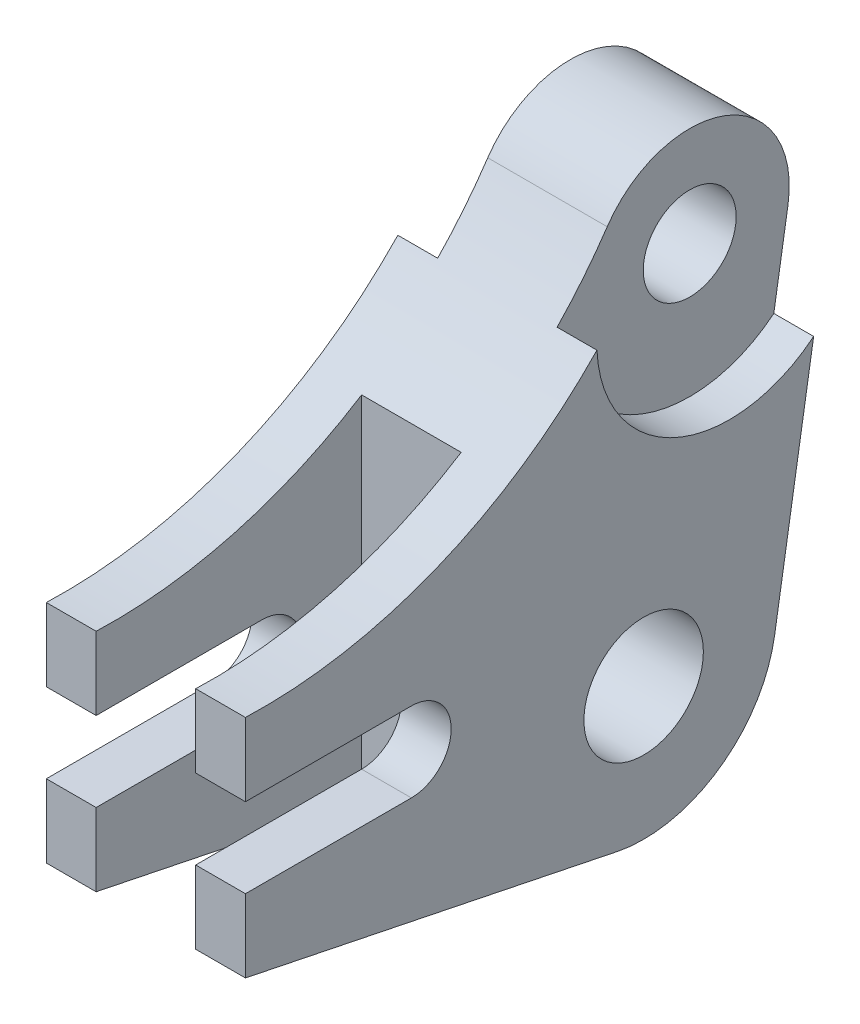
ISO-10303-21;
HEADER;
FILE_DESCRIPTION(('STEP AP214'),'2;1');
FILE_NAME('part.step','',(''),(''),'','','');
FILE_SCHEMA(('AUTOMOTIVE_DESIGN { 1 0 10303 214 1 1 1 1 }'));
ENDSEC;
DATA;
#1=APPLICATION_CONTEXT('core data for automotive mechanical design processes');
#2=APPLICATION_PROTOCOL_DEFINITION('international standard','automotive_design',2000,#1);
#3=PRODUCT_CONTEXT('',#1,'mechanical');
#4=PRODUCT('Part','Part','',(#3));
#5=PRODUCT_RELATED_PRODUCT_CATEGORY('part','',(#4));
#6=PRODUCT_DEFINITION_FORMATION('','',#4);
#7=PRODUCT_DEFINITION_CONTEXT('part definition',#1,'design');
#8=PRODUCT_DEFINITION('design','',#6,#7);
#9=PRODUCT_DEFINITION_SHAPE('','',#8);
#10=(LENGTH_UNIT() NAMED_UNIT(*) SI_UNIT(.MILLI.,.METRE.));
#11=(NAMED_UNIT(*) PLANE_ANGLE_UNIT() SI_UNIT($,.RADIAN.));
#12=(NAMED_UNIT(*) SI_UNIT($,.STERADIAN.) SOLID_ANGLE_UNIT());
#13=UNCERTAINTY_MEASURE_WITH_UNIT(LENGTH_MEASURE(1.E-05),#10,'distance_accuracy_value','');
#14=(GEOMETRIC_REPRESENTATION_CONTEXT(3) GLOBAL_UNCERTAINTY_ASSIGNED_CONTEXT((#13)) GLOBAL_UNIT_ASSIGNED_CONTEXT((#10,
#11,#12)) REPRESENTATION_CONTEXT('',''));
#15=CARTESIAN_POINT('',(0.,0.,0.));
#16=DIRECTION('',(0.,0.,1.));
#17=DIRECTION('',(1.,0.,0.));
#18=AXIS2_PLACEMENT_3D('',#15,#16,#17);
#19=CARTESIAN_POINT('',(15.,95.8680502202487,57.5));
#20=DIRECTION('',(-1.,0.,0.));
#21=DIRECTION('',(0.,0.,1.));
#22=AXIS2_PLACEMENT_3D('',#19,#20,#21);
#23=CYLINDRICAL_SURFACE('',#22,70.);
#24=CARTESIAN_POINT('',(7.50364351418238,95.8680502202487,57.5));
#25=DIRECTION('',(-1.,0.,0.));
#26=DIRECTION('',(0.,0.,1.));
#27=AXIS2_PLACEMENT_3D('',#24,#25,#26);
#28=CIRCLE('',#27,70.);
#29=CARTESIAN_POINT('',(7.50364351418238,25.9127073220826,60.));
#30=VERTEX_POINT('',#29);
#31=CARTESIAN_POINT('',(7.50364351418238,36.7600981325642,20.));
#32=VERTEX_POINT('',#31);
#33=EDGE_CURVE('E274',#30,#32,#28,.F.);
#34=ORIENTED_EDGE('',*,*,#33,.F.);
#35=DIRECTION('',(-1.,0.,0.));
#36=VECTOR('',#35,1.);
#37=CARTESIAN_POINT('',(15.,25.9127073220826,60.));
#38=LINE('',#37,#36);
#39=CARTESIAN_POINT('',(15.,25.9127073220826,60.));
#40=VERTEX_POINT('',#39);
#41=EDGE_CURVE('E222',#40,#30,#38,.T.);
#42=ORIENTED_EDGE('',*,*,#41,.F.);
#43=CARTESIAN_POINT('',(15.,95.8680502202487,57.5));
#44=DIRECTION('',(-1.,0.,0.));
#45=DIRECTION('',(0.,0.,-1.));
#46=AXIS2_PLACEMENT_3D('',#43,#44,#45);
#47=CIRCLE('',#46,70.);
#48=CARTESIAN_POINT('',(15.,47.3554130899807,7.03690419061722));
#49=VERTEX_POINT('',#48);
#50=EDGE_CURVE('E363',#49,#40,#47,.T.);
#51=ORIENTED_EDGE('',*,*,#50,.F.);
#52=DIRECTION('',(1.,0.,0.));
#53=VECTOR('',#52,1.);
#54=CARTESIAN_POINT('',(12.,47.3554130899807,7.03690419061722));
#55=LINE('',#54,#53);
#56=CARTESIAN_POINT('',(9.,47.3554130899807,7.03690419061722));
#57=VERTEX_POINT('',#56);
#58=EDGE_CURVE('E244',#49,#57,#55,.F.);
#59=ORIENTED_EDGE('',*,*,#58,.T.);
#60=CARTESIAN_POINT('',(9.,95.8680502202487,57.5));
#61=DIRECTION('',(1.,0.,0.));
#62=DIRECTION('',(0.,0.,-1.));
#63=AXIS2_PLACEMENT_3D('',#60,#61,#62);
#64=CIRCLE('',#63,70.);
#65=CARTESIAN_POINT('',(9.,56.6913075919468,-0.51019597480941));
#66=VERTEX_POINT('',#65);
#67=EDGE_CURVE('E249',#66,#57,#64,.F.);
#68=ORIENTED_EDGE('',*,*,#67,.F.);
#69=DIRECTION('',(-1.,0.,0.));
#70=VECTOR('',#69,1.);
#71=CARTESIAN_POINT('',(15.,56.6913075919468,-0.51019597480941));
#72=LINE('',#71,#70);
#73=CARTESIAN_POINT('',(-9.,56.6913075919468,-0.510195974809398));
#74=VERTEX_POINT('',#73);
#75=EDGE_CURVE('E228',#66,#74,#72,.T.);
#76=ORIENTED_EDGE('',*,*,#75,.T.);
#77=CARTESIAN_POINT('',(-9.,95.8680502202487,57.5));
#78=DIRECTION('',(-1.,0.,0.));
#79=DIRECTION('',(0.,0.,1.));
#80=AXIS2_PLACEMENT_3D('',#77,#78,#79);
#81=CIRCLE('',#80,70.);
#82=CARTESIAN_POINT('',(-9.,47.3554130899807,7.03690419061722));
#83=VERTEX_POINT('',#82);
#84=EDGE_CURVE('E254',#83,#74,#81,.F.);
#85=ORIENTED_EDGE('',*,*,#84,.F.);
#86=DIRECTION('',(-1.,0.,0.));
#87=VECTOR('',#86,1.);
#88=CARTESIAN_POINT('',(-12.,47.3554130899807,7.03690419061722));
#89=LINE('',#88,#87);
#90=CARTESIAN_POINT('',(-15.,47.3554130899807,7.03690419061722));
#91=VERTEX_POINT('',#90);
#92=EDGE_CURVE('E257',#91,#83,#89,.F.);
#93=ORIENTED_EDGE('',*,*,#92,.F.);
#94=CARTESIAN_POINT('',(-15.,95.8680502202487,57.5));
#95=DIRECTION('',(-1.,0.,0.));
#96=DIRECTION('',(0.,0.,-1.));
#97=AXIS2_PLACEMENT_3D('',#94,#95,#96);
#98=CIRCLE('',#97,70.);
#99=CARTESIAN_POINT('',(-15.,25.9127073220826,60.));
#100=VERTEX_POINT('',#99);
#101=EDGE_CURVE('E219',#91,#100,#98,.T.);
#102=ORIENTED_EDGE('',*,*,#101,.T.);
#103=CARTESIAN_POINT('',(-7.49635648581762,25.9127073220826,60.));
#104=VERTEX_POINT('',#103);
#105=EDGE_CURVE('E211',#104,#100,#38,.T.);
#106=ORIENTED_EDGE('',*,*,#105,.F.);
#107=CARTESIAN_POINT('',(-7.49635648581762,95.8680502202487,57.5));
#108=DIRECTION('',(1.,0.,0.));
#109=DIRECTION('',(0.,0.,-1.));
#110=AXIS2_PLACEMENT_3D('',#107,#108,#109);
#111=CIRCLE('',#110,70.);
#112=CARTESIAN_POINT('',(-7.49635648581762,36.7600981325642,20.));
#113=VERTEX_POINT('',#112);
#114=EDGE_CURVE('E193',#113,#104,#111,.F.);
#115=ORIENTED_EDGE('',*,*,#114,.F.);
#116=DIRECTION('',(-1.,0.,0.));
#117=VECTOR('',#116,1.);
#118=CARTESIAN_POINT('',(15.,36.7600981325642,20.));
#119=LINE('',#118,#117);
#120=EDGE_CURVE('E204',#32,#113,#119,.T.);
#121=ORIENTED_EDGE('',*,*,#120,.F.);
#122=EDGE_LOOP('',(#34,#42,#51,#59,#68,#76,#85,#93,#102,#106,#115,#121));
#123=FACE_BOUND('',#122,.T.);
#124=ADVANCED_FACE('F45',(#123),#23,.F.);
#125=CARTESIAN_POINT('',(15.,25.9127073220826,60.));
#126=DIRECTION('',(0.,0.,-1.));
#127=DIRECTION('',(0.,1.,0.));
#128=AXIS2_PLACEMENT_3D('',#125,#126,#127);
#129=PLANE('',#128);
#130=DIRECTION('',(0.,-1.,0.));
#131=VECTOR('',#130,1.);
#132=CARTESIAN_POINT('',(7.50364351418238,43.8680502202487,60.));
#133=LINE('',#132,#131);
#134=CARTESIAN_POINT('',(7.50364351418238,14.9127073220824,60.));
#135=VERTEX_POINT('',#134);
#136=EDGE_CURVE('E541',#30,#135,#133,.T.);
#137=ORIENTED_EDGE('',*,*,#136,.T.);
#138=DIRECTION('',(-1.,0.,0.));
#139=VECTOR('',#138,1.);
#140=CARTESIAN_POINT('',(15.,14.9127073220825,60.));
#141=LINE('',#140,#139);
#142=CARTESIAN_POINT('',(15.,14.9127073220825,60.));
#143=VERTEX_POINT('',#142);
#144=EDGE_CURVE('E223',#143,#135,#141,.T.);
#145=ORIENTED_EDGE('',*,*,#144,.F.);
#146=DIRECTION('',(0.,-1.,0.));
#147=VECTOR('',#146,1.);
#148=CARTESIAN_POINT('',(15.,25.9127073220826,60.));
#149=LINE('',#148,#147);
#150=EDGE_CURVE('E371',#40,#143,#149,.T.);
#151=ORIENTED_EDGE('',*,*,#150,.F.);
#152=ORIENTED_EDGE('',*,*,#41,.T.);
#153=EDGE_LOOP('',(#137,#145,#151,#152));
#154=FACE_BOUND('',#153,.T.);
#155=ADVANCED_FACE('F492',(#154),#129,.F.);
#156=DIRECTION('',(0.,-1.,0.));
#157=VECTOR('',#156,1.);
#158=CARTESIAN_POINT('',(-7.49635648581762,43.8680502202487,60.));
#159=LINE('',#158,#157);
#160=CARTESIAN_POINT('',(-7.49635648581762,14.9127073220824,60.));
#161=VERTEX_POINT('',#160);
#162=EDGE_CURVE('E196',#104,#161,#159,.T.);
#163=ORIENTED_EDGE('',*,*,#162,.F.);
#164=ORIENTED_EDGE('',*,*,#105,.T.);
#165=DIRECTION('',(0.,-1.,0.));
#166=VECTOR('',#165,1.);
#167=CARTESIAN_POINT('',(-15.,25.9127073220826,60.));
#168=LINE('',#167,#166);
#169=CARTESIAN_POINT('',(-15.,14.9127073220825,60.));
#170=VERTEX_POINT('',#169);
#171=EDGE_CURVE('E332',#100,#170,#168,.T.);
#172=ORIENTED_EDGE('',*,*,#171,.T.);
#173=EDGE_CURVE('E213',#161,#170,#141,.T.);
#174=ORIENTED_EDGE('',*,*,#173,.F.);
#175=EDGE_LOOP('',(#163,#164,#172,#174));
#176=FACE_BOUND('',#175,.T.);
#177=ADVANCED_FACE('F209',(#176),#129,.F.);
#178=CARTESIAN_POINT('',(15.,14.9127073220825,35.));
#179=DIRECTION('',(0.,1.,0.));
#180=DIRECTION('',(0.,0.,1.));
#181=AXIS2_PLACEMENT_3D('',#178,#179,#180);
#182=PLANE('',#181);
#183=DIRECTION('',(0.,0.,1.));
#184=VECTOR('',#183,1.);
#185=CARTESIAN_POINT('',(7.50364351418238,14.9127073220825,35.));
#186=LINE('',#185,#184);
#187=CARTESIAN_POINT('',(7.50364351418238,14.9127073220825,35.));
#188=VERTEX_POINT('',#187);
#189=EDGE_CURVE('E435',#188,#135,#186,.T.);
#190=ORIENTED_EDGE('',*,*,#189,.F.);
#191=DIRECTION('',(-1.,0.,0.));
#192=VECTOR('',#191,1.);
#193=CARTESIAN_POINT('',(15.,14.9127073220825,35.));
#194=LINE('',#193,#192);
#195=CARTESIAN_POINT('',(15.,14.9127073220825,35.));
#196=VERTEX_POINT('',#195);
#197=EDGE_CURVE('E306',#196,#188,#194,.T.);
#198=ORIENTED_EDGE('',*,*,#197,.F.);
#199=DIRECTION('',(0.,0.,-1.));
#200=VECTOR('',#199,1.);
#201=CARTESIAN_POINT('',(15.,14.9127073220825,35.));
#202=LINE('',#201,#200);
#203=EDGE_CURVE('E374',#143,#196,#202,.T.);
#204=ORIENTED_EDGE('',*,*,#203,.F.);
#205=ORIENTED_EDGE('',*,*,#144,.T.);
#206=EDGE_LOOP('',(#190,#198,#204,#205));
#207=FACE_BOUND('',#206,.T.);
#208=ADVANCED_FACE('F530',(#207),#182,.F.);
#209=DIRECTION('',(0.,0.,-1.));
#210=VECTOR('',#209,1.);
#211=CARTESIAN_POINT('',(-7.49635648581762,14.9127073220825,35.));
#212=LINE('',#211,#210);
#213=CARTESIAN_POINT('',(-7.49635648581762,14.9127073220825,35.));
#214=VERTEX_POINT('',#213);
#215=EDGE_CURVE('E205',#161,#214,#212,.T.);
#216=ORIENTED_EDGE('',*,*,#215,.F.);
#217=ORIENTED_EDGE('',*,*,#173,.T.);
#218=DIRECTION('',(0.,0.,-1.));
#219=VECTOR('',#218,1.);
#220=CARTESIAN_POINT('',(-15.,14.9127073220825,35.));
#221=LINE('',#220,#219);
#222=CARTESIAN_POINT('',(-15.,14.9127073220825,35.));
#223=VERTEX_POINT('',#222);
#224=EDGE_CURVE('E328',#170,#223,#221,.T.);
#225=ORIENTED_EDGE('',*,*,#224,.T.);
#226=EDGE_CURVE('E305',#214,#223,#194,.T.);
#227=ORIENTED_EDGE('',*,*,#226,.F.);
#228=EDGE_LOOP('',(#216,#217,#225,#227));
#229=FACE_BOUND('',#228,.T.);
#230=ADVANCED_FACE('F329',(#229),#182,.F.);
#231=CARTESIAN_POINT('',(15.,8.91270732208245,35.));
#232=DIRECTION('',(-1.,0.,0.));
#233=DIRECTION('',(0.,0.,1.));
#234=AXIS2_PLACEMENT_3D('',#231,#232,#233);
#235=CYLINDRICAL_SURFACE('',#234,6.);
#236=CARTESIAN_POINT('',(7.50364351418238,8.91270732208245,35.));
#237=DIRECTION('',(-1.,0.,0.));
#238=DIRECTION('',(0.,0.,1.));
#239=AXIS2_PLACEMENT_3D('',#236,#237,#238);
#240=CIRCLE('',#239,6.);
#241=CARTESIAN_POINT('',(7.50364351418238,2.91270732208245,35.));
#242=VERTEX_POINT('',#241);
#243=EDGE_CURVE('E432',#242,#188,#240,.F.);
#244=ORIENTED_EDGE('',*,*,#243,.F.);
#245=DIRECTION('',(-1.,0.,0.));
#246=VECTOR('',#245,1.);
#247=CARTESIAN_POINT('',(15.,2.91270732208245,35.));
#248=LINE('',#247,#246);
#249=CARTESIAN_POINT('',(15.,2.91270732208245,35.));
#250=VERTEX_POINT('',#249);
#251=EDGE_CURVE('E302',#250,#242,#248,.T.);
#252=ORIENTED_EDGE('',*,*,#251,.F.);
#253=CARTESIAN_POINT('',(15.,8.91270732208245,35.));
#254=DIRECTION('',(-1.,0.,0.));
#255=DIRECTION('',(0.,0.,-1.));
#256=AXIS2_PLACEMENT_3D('',#253,#254,#255);
#257=CIRCLE('',#256,6.);
#258=EDGE_CURVE('E377',#196,#250,#257,.T.);
#259=ORIENTED_EDGE('',*,*,#258,.F.);
#260=ORIENTED_EDGE('',*,*,#197,.T.);
#261=EDGE_LOOP('',(#244,#252,#259,#260));
#262=FACE_BOUND('',#261,.T.);
#263=ADVANCED_FACE('F528',(#262),#235,.F.);
#264=CARTESIAN_POINT('',(-7.49635648581762,8.91270732208245,35.));
#265=DIRECTION('',(1.,0.,0.));
#266=DIRECTION('',(0.,0.,-1.));
#267=AXIS2_PLACEMENT_3D('',#264,#265,#266);
#268=CIRCLE('',#267,6.);
#269=CARTESIAN_POINT('',(-7.49635648581762,2.91270732208245,35.));
#270=VERTEX_POINT('',#269);
#271=EDGE_CURVE('E325',#214,#270,#268,.F.);
#272=ORIENTED_EDGE('',*,*,#271,.F.);
#273=ORIENTED_EDGE('',*,*,#226,.T.);
#274=CARTESIAN_POINT('',(-15.,8.91270732208245,35.));
#275=DIRECTION('',(-1.,0.,0.));
#276=DIRECTION('',(0.,0.,-1.));
#277=AXIS2_PLACEMENT_3D('',#274,#275,#276);
#278=CIRCLE('',#277,6.);
#279=CARTESIAN_POINT('',(-15.,2.91270732208245,35.));
#280=VERTEX_POINT('',#279);
#281=EDGE_CURVE('E323',#223,#280,#278,.T.);
#282=ORIENTED_EDGE('',*,*,#281,.T.);
#283=EDGE_CURVE('E301',#270,#280,#248,.T.);
#284=ORIENTED_EDGE('',*,*,#283,.F.);
#285=EDGE_LOOP('',(#272,#273,#282,#284));
#286=FACE_BOUND('',#285,.T.);
#287=ADVANCED_FACE('F320',(#286),#235,.F.);
#288=CARTESIAN_POINT('',(15.,2.91270732208245,35.));
#289=DIRECTION('',(0.,-1.,0.));
#290=DIRECTION('',(0.,0.,-1.));
#291=AXIS2_PLACEMENT_3D('',#288,#289,#290);
#292=PLANE('',#291);
#293=DIRECTION('',(0.,0.,-1.));
#294=VECTOR('',#293,1.);
#295=CARTESIAN_POINT('',(7.50364351418238,2.91270732208245,35.));
#296=LINE('',#295,#294);
#297=CARTESIAN_POINT('',(7.50364351418238,2.91270732208245,60.));
#298=VERTEX_POINT('',#297);
#299=EDGE_CURVE('E429',#298,#242,#296,.T.);
#300=ORIENTED_EDGE('',*,*,#299,.F.);
#301=DIRECTION('',(-1.,0.,0.));
#302=VECTOR('',#301,1.);
#303=CARTESIAN_POINT('',(15.,2.91270732208245,60.));
#304=LINE('',#303,#302);
#305=CARTESIAN_POINT('',(15.,2.91270732208245,60.));
#306=VERTEX_POINT('',#305);
#307=EDGE_CURVE('E293',#306,#298,#304,.T.);
#308=ORIENTED_EDGE('',*,*,#307,.F.);
#309=DIRECTION('',(0.,0.,1.));
#310=VECTOR('',#309,1.);
#311=CARTESIAN_POINT('',(15.,2.91270732208245,35.));
#312=LINE('',#311,#310);
#313=EDGE_CURVE('E380',#250,#306,#312,.T.);
#314=ORIENTED_EDGE('',*,*,#313,.F.);
#315=ORIENTED_EDGE('',*,*,#251,.T.);
#316=EDGE_LOOP('',(#300,#308,#314,#315));
#317=FACE_BOUND('',#316,.T.);
#318=ADVANCED_FACE('F524',(#317),#292,.F.);
#319=DIRECTION('',(0.,0.,1.));
#320=VECTOR('',#319,1.);
#321=CARTESIAN_POINT('',(-7.49635648581762,2.91270732208245,35.));
#322=LINE('',#321,#320);
#323=CARTESIAN_POINT('',(-7.49635648581762,2.91270732208245,60.));
#324=VERTEX_POINT('',#323);
#325=EDGE_CURVE('E276',#270,#324,#322,.T.);
#326=ORIENTED_EDGE('',*,*,#325,.F.);
#327=ORIENTED_EDGE('',*,*,#283,.T.);
#328=DIRECTION('',(0.,0.,1.));
#329=VECTOR('',#328,1.);
#330=CARTESIAN_POINT('',(-15.,2.91270732208245,35.));
#331=LINE('',#330,#329);
#332=CARTESIAN_POINT('',(-15.,2.91270732208245,60.));
#333=VERTEX_POINT('',#332);
#334=EDGE_CURVE('E339',#280,#333,#331,.T.);
#335=ORIENTED_EDGE('',*,*,#334,.T.);
#336=EDGE_CURVE('E288',#324,#333,#304,.T.);
#337=ORIENTED_EDGE('',*,*,#336,.F.);
#338=EDGE_LOOP('',(#326,#327,#335,#337));
#339=FACE_BOUND('',#338,.T.);
#340=ADVANCED_FACE('F417',(#339),#292,.F.);
#341=CARTESIAN_POINT('',(15.,2.91270732208245,60.));
#342=DIRECTION('',(0.,0.,-1.));
#343=DIRECTION('',(-1.,0.,0.));
#344=AXIS2_PLACEMENT_3D('',#341,#342,#343);
#345=PLANE('',#344);
#346=CARTESIAN_POINT('',(7.50364351418238,-8.08729267791755,60.));
#347=VERTEX_POINT('',#346);
#348=EDGE_CURVE('E545',#298,#347,#133,.T.);
#349=ORIENTED_EDGE('',*,*,#348,.T.);
#350=DIRECTION('',(-1.,0.,0.));
#351=VECTOR('',#350,1.);
#352=CARTESIAN_POINT('',(15.,-8.08729267791755,60.));
#353=LINE('',#352,#351);
#354=CARTESIAN_POINT('',(15.,-8.08729267791755,60.));
#355=VERTEX_POINT('',#354);
#356=EDGE_CURVE('E282',#355,#347,#353,.T.);
#357=ORIENTED_EDGE('',*,*,#356,.F.);
#358=DIRECTION('',(0.,-1.,0.));
#359=VECTOR('',#358,1.);
#360=CARTESIAN_POINT('',(15.,2.91270732208245,60.));
#361=LINE('',#360,#359);
#362=EDGE_CURVE('E383',#306,#355,#361,.T.);
#363=ORIENTED_EDGE('',*,*,#362,.F.);
#364=ORIENTED_EDGE('',*,*,#307,.T.);
#365=EDGE_LOOP('',(#349,#357,#363,#364));
#366=FACE_BOUND('',#365,.T.);
#367=ADVANCED_FACE('F521',(#366),#345,.F.);
#368=CARTESIAN_POINT('',(-7.49635648581762,-8.08729267791755,60.));
#369=VERTEX_POINT('',#368);
#370=EDGE_CURVE('E61',#324,#369,#159,.T.);
#371=ORIENTED_EDGE('',*,*,#370,.F.);
#372=ORIENTED_EDGE('',*,*,#336,.T.);
#373=DIRECTION('',(0.,-1.,0.));
#374=VECTOR('',#373,1.);
#375=CARTESIAN_POINT('',(-15.,2.91270732208245,60.));
#376=LINE('',#375,#374);
#377=CARTESIAN_POINT('',(-15.,-8.08729267791755,60.));
#378=VERTEX_POINT('',#377);
#379=EDGE_CURVE('E343',#333,#378,#376,.T.);
#380=ORIENTED_EDGE('',*,*,#379,.T.);
#381=EDGE_CURVE('E289',#369,#378,#353,.T.);
#382=ORIENTED_EDGE('',*,*,#381,.F.);
#383=EDGE_LOOP('',(#371,#372,#380,#382));
#384=FACE_BOUND('',#383,.T.);
#385=ADVANCED_FACE('F413',(#384),#345,.F.);
#386=CARTESIAN_POINT('',(15.,-8.08729267791755,60.));
#387=DIRECTION('',(0.,0.979528751931656,-0.201304307304169));
#388=DIRECTION('',(0.,0.201304307304169,0.979528751931657));
#389=AXIS2_PLACEMENT_3D('',#386,#387,#388);
#390=PLANE('',#389);
#391=DIRECTION('',(0.,0.201304307304169,0.979528751931657));
#392=VECTOR('',#391,1.);
#393=CARTESIAN_POINT('',(7.50364351418238,-8.08729267791755,60.));
#394=LINE('',#393,#392);
#395=CARTESIAN_POINT('',(7.50364351418238,-16.307747949177,20.));
#396=VERTEX_POINT('',#395);
#397=EDGE_CURVE('E11',#396,#347,#394,.T.);
#398=ORIENTED_EDGE('',*,*,#397,.F.);
#399=DIRECTION('',(1.,0.,0.));
#400=VECTOR('',#399,1.);
#401=CARTESIAN_POINT('',(15.,-16.307747949177,20.));
#402=LINE('',#401,#400);
#403=CARTESIAN_POINT('',(-7.49635648581762,-16.307747949177,20.));
#404=VERTEX_POINT('',#403);
#405=EDGE_CURVE('E54',#404,#396,#402,.T.);
#406=ORIENTED_EDGE('',*,*,#405,.F.);
#407=DIRECTION('',(0.,-0.201304307304169,-0.979528751931657));
#408=VECTOR('',#407,1.);
#409=CARTESIAN_POINT('',(-7.49635648581762,-8.08729267791755,60.));
#410=LINE('',#409,#408);
#411=EDGE_CURVE('E260',#369,#404,#410,.T.);
#412=ORIENTED_EDGE('',*,*,#411,.F.);
#413=ORIENTED_EDGE('',*,*,#381,.T.);
#414=DIRECTION('',(0.,-0.201304307304169,-0.979528751931656));
#415=VECTOR('',#414,1.);
#416=CARTESIAN_POINT('',(-15.,-8.08729267791755,60.));
#417=LINE('',#416,#415);
#418=CARTESIAN_POINT('',(-15.,-19.593650885077,4.01109025000956));
#419=VERTEX_POINT('',#418);
#420=EDGE_CURVE('E349',#378,#419,#417,.T.);
#421=ORIENTED_EDGE('',*,*,#420,.T.);
#422=DIRECTION('',(-1.,0.,0.));
#423=VECTOR('',#422,1.);
#424=CARTESIAN_POINT('',(15.,-19.593650885077,4.01109025000956));
#425=LINE('',#424,#423);
#426=CARTESIAN_POINT('',(15.,-19.593650885077,4.01109025000956));
#427=VERTEX_POINT('',#426);
#428=EDGE_CURVE('E295',#427,#419,#425,.T.);
#429=ORIENTED_EDGE('',*,*,#428,.F.);
#430=DIRECTION('',(0.,-0.201304307304169,-0.979528751931656));
#431=VECTOR('',#430,1.);
#432=CARTESIAN_POINT('',(15.,-8.08729267791755,60.));
#433=LINE('',#432,#431);
#434=EDGE_CURVE('E284',#355,#427,#433,.T.);
#435=ORIENTED_EDGE('',*,*,#434,.F.);
#436=ORIENTED_EDGE('',*,*,#356,.T.);
#437=EDGE_LOOP('',(#398,#406,#412,#413,#421,#429,#435,#436));
#438=FACE_BOUND('',#437,.T.);
#439=ADVANCED_FACE('F279',(#438),#390,.F.);
#440=CARTESIAN_POINT('',(15.,48.2962913144535,-12.9409522551257));
#441=DIRECTION('',(-1.,0.,0.));
#442=DIRECTION('',(0.,0.,1.));
#443=AXIS2_PLACEMENT_3D('',#440,#441,#442);
#444=CYLINDRICAL_SURFACE('',#443,15.);
#445=CARTESIAN_POINT('',(-9.,48.2962913144535,-12.9409522551257));
#446=DIRECTION('',(-1.,0.,0.));
#447=DIRECTION('',(0.,0.,1.));
#448=AXIS2_PLACEMENT_3D('',#445,#446,#447);
#449=CIRCLE('',#448,15.);
#450=CARTESIAN_POINT('',(-9.,45.8823545784731,-27.7454417577963));
#451=VERTEX_POINT('',#450);
#452=EDGE_CURVE('E441',#74,#451,#449,.T.);
#453=ORIENTED_EDGE('',*,*,#452,.F.);
#454=ORIENTED_EDGE('',*,*,#75,.F.);
#455=CARTESIAN_POINT('',(9.,48.2962913144535,-12.9409522551257));
#456=DIRECTION('',(1.,0.,0.));
#457=DIRECTION('',(0.,0.,-1.));
#458=AXIS2_PLACEMENT_3D('',#455,#456,#457);
#459=CIRCLE('',#458,15.);
#460=CARTESIAN_POINT('',(9.,45.8823545784731,-27.7454417577963));
#461=VERTEX_POINT('',#460);
#462=EDGE_CURVE('E462',#461,#66,#459,.T.);
#463=ORIENTED_EDGE('',*,*,#462,.F.);
#464=DIRECTION('',(-1.,0.,0.));
#465=VECTOR('',#464,1.);
#466=CARTESIAN_POINT('',(15.,45.8823545784731,-27.7454417577963));
#467=LINE('',#466,#465);
#468=EDGE_CURVE('E236',#461,#451,#467,.T.);
#469=ORIENTED_EDGE('',*,*,#468,.T.);
#470=EDGE_LOOP('',(#453,#454,#463,#469));
#471=FACE_BOUND('',#470,.T.);
#472=ADVANCED_FACE('F502',(#471),#444,.T.);
#473=CARTESIAN_POINT('',(15.,48.2962913144535,-12.9409522551257));
#474=DIRECTION('',(-1.,0.,0.));
#475=DIRECTION('',(0.,0.,1.));
#476=AXIS2_PLACEMENT_3D('',#473,#474,#475);
#477=CYLINDRICAL_SURFACE('',#476,7.);
#478=CARTESIAN_POINT('',(9.,48.2962913144535,-12.9409522551257));
#479=DIRECTION('',(1.,0.,0.));
#480=DIRECTION('',(0.,0.,-1.));
#481=AXIS2_PLACEMENT_3D('',#478,#479,#480);
#482=CIRCLE('',#481,7.);
#483=CARTESIAN_POINT('',(9.,48.2962913144535,-19.9409522551257));
#484=VERTEX_POINT('',#483);
#485=EDGE_CURVE('E245',#484,#484,#482,.T.);
#486=ORIENTED_EDGE('',*,*,#485,.T.);
#487=EDGE_LOOP('',(#486));
#488=FACE_BOUND('',#487,.T.);
#489=CARTESIAN_POINT('',(-9.,48.2962913144535,-12.9409522551257));
#490=DIRECTION('',(-1.,0.,0.));
#491=DIRECTION('',(0.,0.,1.));
#492=AXIS2_PLACEMENT_3D('',#489,#490,#491);
#493=CIRCLE('',#492,7.);
#494=CARTESIAN_POINT('',(-9.,48.2962913144535,-5.94095225512573));
#495=VERTEX_POINT('',#494);
#496=EDGE_CURVE('E448',#495,#495,#493,.T.);
#497=ORIENTED_EDGE('',*,*,#496,.T.);
#498=EDGE_LOOP('',(#497));
#499=FACE_BOUND('',#498,.T.);
#500=ADVANCED_FACE('F504',(#488,#499),#477,.F.);
#501=CARTESIAN_POINT('',(15.,-3.21858231464053,-19.7393193368942));
#502=DIRECTION('',(0.,0.160929115732027,0.986965966844707));
#503=DIRECTION('',(0.,-0.986965966844707,0.160929115732027));
#504=AXIS2_PLACEMENT_3D('',#501,#502,#503);
#505=PLANE('',#504);
#506=DIRECTION('',(-1.,0.,0.));
#507=VECTOR('',#506,1.);
#508=CARTESIAN_POINT('',(-9.,32.8260220746955,-25.616549663114));
#509=LINE('',#508,#507);
#510=CARTESIAN_POINT('',(-9.,32.8260220746955,-25.616549663114));
#511=VERTEX_POINT('',#510);
#512=CARTESIAN_POINT('',(-15.,32.8260220746955,-25.616549663114));
#513=VERTEX_POINT('',#512);
#514=EDGE_CURVE('E408',#511,#513,#509,.T.);
#515=ORIENTED_EDGE('',*,*,#514,.F.);
#516=DIRECTION('',(0.,-0.986965966844707,0.160929115732027));
#517=VECTOR('',#516,1.);
#518=CARTESIAN_POINT('',(-9.,-3.21858231464053,-19.7393193368942));
#519=LINE('',#518,#517);
#520=EDGE_CURVE('E445',#451,#511,#519,.T.);
#521=ORIENTED_EDGE('',*,*,#520,.F.);
#522=ORIENTED_EDGE('',*,*,#468,.F.);
#523=DIRECTION('',(0.,0.986965966844707,-0.160929115732027));
#524=VECTOR('',#523,1.);
#525=CARTESIAN_POINT('',(9.,-3.21858231464053,-19.7393193368942));
#526=LINE('',#525,#524);
#527=CARTESIAN_POINT('',(9.,32.8260220746955,-25.616549663114));
#528=VERTEX_POINT('',#527);
#529=EDGE_CURVE('E465',#528,#461,#526,.T.);
#530=ORIENTED_EDGE('',*,*,#529,.F.);
#531=DIRECTION('',(1.,0.,0.));
#532=VECTOR('',#531,1.);
#533=CARTESIAN_POINT('',(9.,32.8260220746955,-25.616549663114));
#534=LINE('',#533,#532);
#535=CARTESIAN_POINT('',(15.,32.8260220746955,-25.616549663114));
#536=VERTEX_POINT('',#535);
#537=EDGE_CURVE('E468',#528,#536,#534,.T.);
#538=ORIENTED_EDGE('',*,*,#537,.T.);
#539=DIRECTION('',(0.,0.986965966844707,-0.160929115732027));
#540=VECTOR('',#539,1.);
#541=CARTESIAN_POINT('',(15.,-3.21858231464053,-19.7393193368942));
#542=LINE('',#541,#540);
#543=CARTESIAN_POINT('',(15.,-3.21858231464053,-19.7393193368942));
#544=VERTEX_POINT('',#543);
#545=EDGE_CURVE('E356',#544,#536,#542,.T.);
#546=ORIENTED_EDGE('',*,*,#545,.F.);
#547=DIRECTION('',(-1.,0.,0.));
#548=VECTOR('',#547,1.);
#549=CARTESIAN_POINT('',(15.,-3.21858231464053,-19.7393193368942));
#550=LINE('',#549,#548);
#551=CARTESIAN_POINT('',(-15.,-3.21858231464053,-19.7393193368942));
#552=VERTEX_POINT('',#551);
#553=EDGE_CURVE('E240',#544,#552,#550,.T.);
#554=ORIENTED_EDGE('',*,*,#553,.T.);
#555=DIRECTION('',(0.,0.986965966844707,-0.160929115732027));
#556=VECTOR('',#555,1.);
#557=CARTESIAN_POINT('',(-15.,-3.21858231464053,-19.7393193368942));
#558=LINE('',#557,#556);
#559=EDGE_CURVE('E392',#552,#513,#558,.T.);
#560=ORIENTED_EDGE('',*,*,#559,.T.);
#561=EDGE_LOOP('',(#515,#521,#522,#530,#538,#546,#554,#560));
#562=FACE_BOUND('',#561,.T.);
#563=ADVANCED_FACE('F406',(#562),#505,.F.);
#564=CARTESIAN_POINT('',(15.,0.,0.));
#565=DIRECTION('',(1.,0.,0.));
#566=DIRECTION('',(0.,0.,-1.));
#567=AXIS2_PLACEMENT_3D('',#564,#565,#566);
#568=PLANE('',#567);
#569=CARTESIAN_POINT('',(15.,48.2962913144535,-12.9409522551257));
#570=DIRECTION('',(1.,0.,0.));
#571=DIRECTION('',(0.,0.,-1.));
#572=AXIS2_PLACEMENT_3D('',#569,#570,#571);
#573=CIRCLE('',#572,20.);
#574=EDGE_CURVE('E454',#49,#536,#573,.T.);
#575=ORIENTED_EDGE('',*,*,#574,.F.);
#576=ORIENTED_EDGE('',*,*,#50,.T.);
#577=ORIENTED_EDGE('',*,*,#150,.T.);
#578=ORIENTED_EDGE('',*,*,#203,.T.);
#579=ORIENTED_EDGE('',*,*,#258,.T.);
#580=ORIENTED_EDGE('',*,*,#313,.T.);
#581=ORIENTED_EDGE('',*,*,#362,.T.);
#582=ORIENTED_EDGE('',*,*,#434,.T.);
#583=CARTESIAN_POINT('',(15.,0.,0.));
#584=DIRECTION('',(1.,0.,0.));
#585=DIRECTION('',(0.,0.,-1.));
#586=AXIS2_PLACEMENT_3D('',#583,#584,#585);
#587=CIRCLE('',#586,20.);
#588=EDGE_CURVE('E351',#427,#544,#587,.T.);
#589=ORIENTED_EDGE('',*,*,#588,.T.);
#590=ORIENTED_EDGE('',*,*,#545,.T.);
#591=EDGE_LOOP('',(#575,#576,#577,#578,#579,#580,#581,#582,#589,#590));
#592=FACE_BOUND('',#591,.T.);
#593=CARTESIAN_POINT('',(15.,0.,0.));
#594=DIRECTION('',(1.,0.,0.));
#595=DIRECTION('',(0.,0.,-1.));
#596=AXIS2_PLACEMENT_3D('',#593,#594,#595);
#597=CIRCLE('',#596,9.);
#598=CARTESIAN_POINT('',(15.,0.,-9.));
#599=VERTEX_POINT('',#598);
#600=EDGE_CURVE('E393',#599,#599,#597,.T.);
#601=ORIENTED_EDGE('',*,*,#600,.F.);
#602=EDGE_LOOP('',(#601));
#603=FACE_BOUND('',#602,.T.);
#604=ADVANCED_FACE('F507',(#592,#603),#568,.T.);
#605=CARTESIAN_POINT('',(-15.,0.,0.));
#606=DIRECTION('',(1.,0.,0.));
#607=DIRECTION('',(0.,0.,-1.));
#608=AXIS2_PLACEMENT_3D('',#605,#606,#607);
#609=PLANE('',#608);
#610=CARTESIAN_POINT('',(-15.,48.2962913144535,-12.9409522551257));
#611=DIRECTION('',(1.,0.,0.));
#612=DIRECTION('',(0.,0.,-1.));
#613=AXIS2_PLACEMENT_3D('',#610,#611,#612);
#614=CIRCLE('',#613,20.);
#615=EDGE_CURVE('E399',#91,#513,#614,.T.);
#616=ORIENTED_EDGE('',*,*,#615,.T.);
#617=ORIENTED_EDGE('',*,*,#559,.F.);
#618=CARTESIAN_POINT('',(-15.,0.,0.));
#619=DIRECTION('',(1.,0.,0.));
#620=DIRECTION('',(0.,0.,-1.));
#621=AXIS2_PLACEMENT_3D('',#618,#619,#620);
#622=CIRCLE('',#621,20.);
#623=EDGE_CURVE('E388',#419,#552,#622,.T.);
#624=ORIENTED_EDGE('',*,*,#623,.F.);
#625=ORIENTED_EDGE('',*,*,#420,.F.);
#626=ORIENTED_EDGE('',*,*,#379,.F.);
#627=ORIENTED_EDGE('',*,*,#334,.F.);
#628=ORIENTED_EDGE('',*,*,#281,.F.);
#629=ORIENTED_EDGE('',*,*,#224,.F.);
#630=ORIENTED_EDGE('',*,*,#171,.F.);
#631=ORIENTED_EDGE('',*,*,#101,.F.);
#632=EDGE_LOOP('',(#616,#617,#624,#625,#626,#627,#628,#629,#630,#631));
#633=FACE_BOUND('',#632,.T.);
#634=CARTESIAN_POINT('',(-15.,0.,0.));
#635=DIRECTION('',(1.,0.,0.));
#636=DIRECTION('',(0.,0.,-1.));
#637=AXIS2_PLACEMENT_3D('',#634,#635,#636);
#638=CIRCLE('',#637,9.);
#639=CARTESIAN_POINT('',(-15.,0.,-9.));
#640=VERTEX_POINT('',#639);
#641=EDGE_CURVE('E366',#640,#640,#638,.T.);
#642=ORIENTED_EDGE('',*,*,#641,.T.);
#643=EDGE_LOOP('',(#642));
#644=FACE_BOUND('',#643,.T.);
#645=ADVANCED_FACE('F335',(#633,#644),#609,.F.);
#646=CARTESIAN_POINT('',(15.,0.,0.));
#647=DIRECTION('',(-1.,0.,0.));
#648=DIRECTION('',(0.,0.,1.));
#649=AXIS2_PLACEMENT_3D('',#646,#647,#648);
#650=CYLINDRICAL_SURFACE('',#649,20.);
#651=ORIENTED_EDGE('',*,*,#623,.T.);
#652=ORIENTED_EDGE('',*,*,#553,.F.);
#653=ORIENTED_EDGE('',*,*,#588,.F.);
#654=ORIENTED_EDGE('',*,*,#428,.T.);
#655=EDGE_LOOP('',(#651,#652,#653,#654));
#656=FACE_BOUND('',#655,.T.);
#657=ADVANCED_FACE('F47',(#656),#650,.T.);
#658=CARTESIAN_POINT('',(15.,0.,0.));
#659=DIRECTION('',(-1.,0.,0.));
#660=DIRECTION('',(0.,0.,1.));
#661=AXIS2_PLACEMENT_3D('',#658,#659,#660);
#662=CYLINDRICAL_SURFACE('',#661,9.);
#663=ORIENTED_EDGE('',*,*,#600,.T.);
#664=EDGE_LOOP('',(#663));
#665=FACE_BOUND('',#664,.T.);
#666=ORIENTED_EDGE('',*,*,#641,.F.);
#667=EDGE_LOOP('',(#666));
#668=FACE_BOUND('',#667,.T.);
#669=ADVANCED_FACE('F478',(#665,#668),#662,.F.);
#670=CARTESIAN_POINT('',(9.,48.2962913144535,-12.9409522551257));
#671=DIRECTION('',(1.,0.,0.));
#672=DIRECTION('',(0.,0.,-1.));
#673=AXIS2_PLACEMENT_3D('',#670,#671,#672);
#674=CYLINDRICAL_SURFACE('',#673,20.);
#675=CARTESIAN_POINT('',(9.,48.2962913144535,-12.9409522551257));
#676=DIRECTION('',(1.,0.,0.));
#677=DIRECTION('',(0.,0.,-1.));
#678=AXIS2_PLACEMENT_3D('',#675,#676,#677);
#679=CIRCLE('',#678,20.);
#680=EDGE_CURVE('E250',#57,#528,#679,.T.);
#681=ORIENTED_EDGE('',*,*,#680,.F.);
#682=ORIENTED_EDGE('',*,*,#58,.F.);
#683=ORIENTED_EDGE('',*,*,#574,.T.);
#684=ORIENTED_EDGE('',*,*,#537,.F.);
#685=EDGE_LOOP('',(#681,#682,#683,#684));
#686=FACE_BOUND('',#685,.T.);
#687=ADVANCED_FACE('F480',(#686),#674,.F.);
#688=CARTESIAN_POINT('',(9.,48.2962913144535,-12.9409522551257));
#689=DIRECTION('',(1.,0.,0.));
#690=DIRECTION('',(0.,0.,-1.));
#691=AXIS2_PLACEMENT_3D('',#688,#689,#690);
#692=PLANE('',#691);
#693=ORIENTED_EDGE('',*,*,#485,.F.);
#694=EDGE_LOOP('',(#693));
#695=FACE_BOUND('',#694,.T.);
#696=ORIENTED_EDGE('',*,*,#529,.T.);
#697=ORIENTED_EDGE('',*,*,#462,.T.);
#698=ORIENTED_EDGE('',*,*,#67,.T.);
#699=ORIENTED_EDGE('',*,*,#680,.T.);
#700=EDGE_LOOP('',(#696,#697,#698,#699));
#701=FACE_BOUND('',#700,.T.);
#702=ADVANCED_FACE('F487',(#695,#701),#692,.T.);
#703=CARTESIAN_POINT('',(-9.,48.2962913144535,-12.9409522551257));
#704=DIRECTION('',(-1.,0.,0.));
#705=DIRECTION('',(0.,0.,1.));
#706=AXIS2_PLACEMENT_3D('',#703,#704,#705);
#707=CYLINDRICAL_SURFACE('',#706,20.);
#708=ORIENTED_EDGE('',*,*,#514,.T.);
#709=ORIENTED_EDGE('',*,*,#615,.F.);
#710=ORIENTED_EDGE('',*,*,#92,.T.);
#711=CARTESIAN_POINT('',(-9.,48.2962913144535,-12.9409522551257));
#712=DIRECTION('',(1.,0.,0.));
#713=DIRECTION('',(0.,0.,-1.));
#714=AXIS2_PLACEMENT_3D('',#711,#712,#713);
#715=CIRCLE('',#714,20.);
#716=EDGE_CURVE('E69',#83,#511,#715,.T.);
#717=ORIENTED_EDGE('',*,*,#716,.T.);
#718=EDGE_LOOP('',(#708,#709,#710,#717));
#719=FACE_BOUND('',#718,.T.);
#720=ADVANCED_FACE('F567',(#719),#707,.F.);
#721=CARTESIAN_POINT('',(-9.,48.2962913144535,-12.9409522551257));
#722=DIRECTION('',(-1.,0.,0.));
#723=DIRECTION('',(0.,0.,-1.));
#724=AXIS2_PLACEMENT_3D('',#721,#722,#723);
#725=PLANE('',#724);
#726=ORIENTED_EDGE('',*,*,#496,.F.);
#727=EDGE_LOOP('',(#726));
#728=FACE_BOUND('',#727,.T.);
#729=ORIENTED_EDGE('',*,*,#520,.T.);
#730=ORIENTED_EDGE('',*,*,#716,.F.);
#731=ORIENTED_EDGE('',*,*,#84,.T.);
#732=ORIENTED_EDGE('',*,*,#452,.T.);
#733=EDGE_LOOP('',(#729,#730,#731,#732));
#734=FACE_BOUND('',#733,.T.);
#735=ADVANCED_FACE('F566',(#728,#734),#725,.T.);
#736=CARTESIAN_POINT('',(7.50364351418238,43.8680502202487,20.));
#737=DIRECTION('',(-1.,0.,0.));
#738=DIRECTION('',(0.,0.,1.));
#739=AXIS2_PLACEMENT_3D('',#736,#737,#738);
#740=PLANE('',#739);
#741=ORIENTED_EDGE('',*,*,#33,.T.);
#742=DIRECTION('',(0.,-1.,0.));
#743=VECTOR('',#742,1.);
#744=CARTESIAN_POINT('',(7.50364351418238,43.8680502202487,20.));
#745=LINE('',#744,#743);
#746=EDGE_CURVE('E268',#32,#396,#745,.T.);
#747=ORIENTED_EDGE('',*,*,#746,.T.);
#748=ORIENTED_EDGE('',*,*,#397,.T.);
#749=ORIENTED_EDGE('',*,*,#348,.F.);
#750=ORIENTED_EDGE('',*,*,#299,.T.);
#751=ORIENTED_EDGE('',*,*,#243,.T.);
#752=ORIENTED_EDGE('',*,*,#189,.T.);
#753=ORIENTED_EDGE('',*,*,#136,.F.);
#754=EDGE_LOOP('',(#741,#747,#748,#749,#750,#751,#752,#753));
#755=FACE_BOUND('',#754,.T.);
#756=ADVANCED_FACE('F272',(#755),#740,.T.);
#757=CARTESIAN_POINT('',(-7.49635648581762,43.8680502202487,20.));
#758=DIRECTION('',(0.,0.,1.));
#759=DIRECTION('',(1.,0.,0.));
#760=AXIS2_PLACEMENT_3D('',#757,#758,#759);
#761=PLANE('',#760);
#762=ORIENTED_EDGE('',*,*,#120,.T.);
#763=DIRECTION('',(0.,-1.,0.));
#764=VECTOR('',#763,1.);
#765=CARTESIAN_POINT('',(-7.49635648581762,43.8680502202487,20.));
#766=LINE('',#765,#764);
#767=EDGE_CURVE('E199',#113,#404,#766,.T.);
#768=ORIENTED_EDGE('',*,*,#767,.T.);
#769=ORIENTED_EDGE('',*,*,#405,.T.);
#770=ORIENTED_EDGE('',*,*,#746,.F.);
#771=EDGE_LOOP('',(#762,#768,#769,#770));
#772=FACE_BOUND('',#771,.T.);
#773=ADVANCED_FACE('F267',(#772),#761,.T.);
#774=CARTESIAN_POINT('',(-7.49635648581762,43.8680502202487,20.));
#775=DIRECTION('',(1.,0.,0.));
#776=DIRECTION('',(0.,0.,-1.));
#777=AXIS2_PLACEMENT_3D('',#774,#775,#776);
#778=PLANE('',#777);
#779=ORIENTED_EDGE('',*,*,#114,.T.);
#780=ORIENTED_EDGE('',*,*,#162,.T.);
#781=ORIENTED_EDGE('',*,*,#215,.T.);
#782=ORIENTED_EDGE('',*,*,#271,.T.);
#783=ORIENTED_EDGE('',*,*,#325,.T.);
#784=ORIENTED_EDGE('',*,*,#370,.T.);
#785=ORIENTED_EDGE('',*,*,#411,.T.);
#786=ORIENTED_EDGE('',*,*,#767,.F.);
#787=EDGE_LOOP('',(#779,#780,#781,#782,#783,#784,#785,#786));
#788=FACE_BOUND('',#787,.T.);
#789=ADVANCED_FACE('F195',(#788),#778,.T.);
#790=CLOSED_SHELL('',(#124,#155,#177,#208,#230,#263,#287,#318,#340,#367,#385,#439,#472,#500,
#563,#604,#645,#657,#669,#687,#702,#720,#735,#756,#773,#789));
#791=MANIFOLD_SOLID_BREP('B2',#790);
#792=ADVANCED_BREP_SHAPE_REPRESENTATION('',(#18,#791),#14);
#793=SHAPE_DEFINITION_REPRESENTATION(#9,#792);
ENDSEC;
END-ISO-10303-21;
